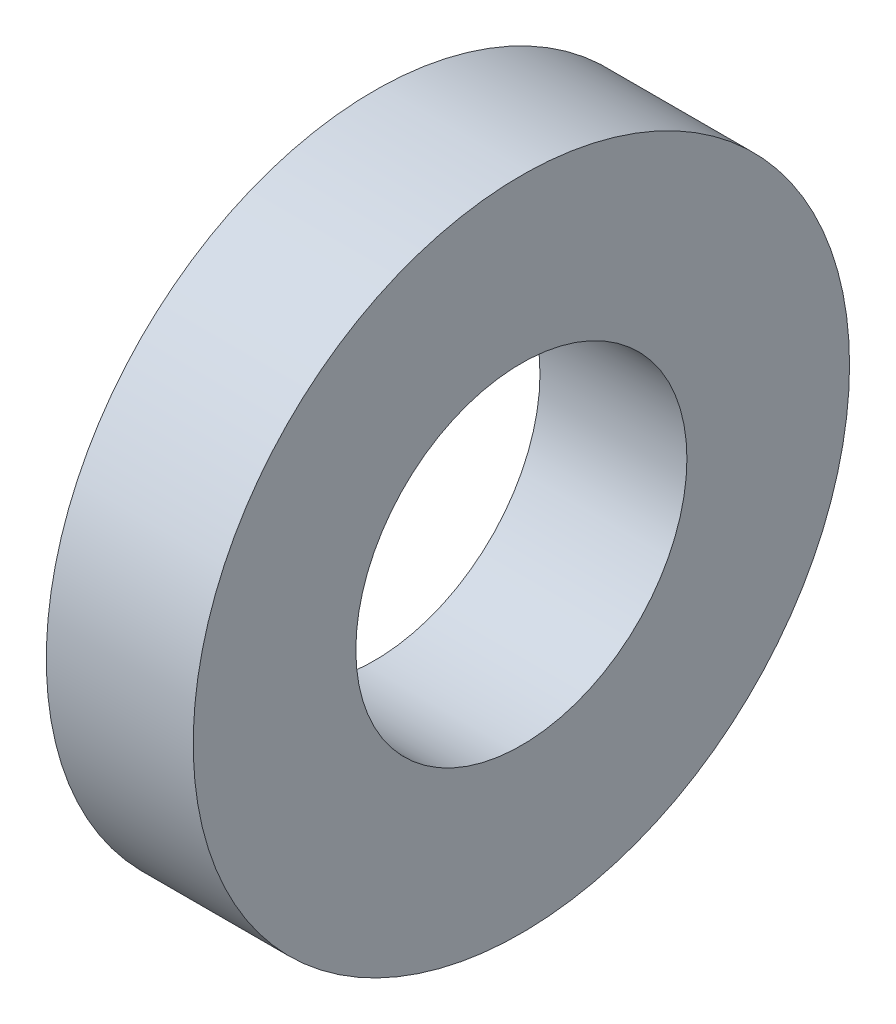
ISO-10303-21;
HEADER;
FILE_DESCRIPTION(('STEP AP214'),'2;1');
FILE_NAME('part.step','',(''),(''),'','','');
FILE_SCHEMA(('AUTOMOTIVE_DESIGN { 1 0 10303 214 1 1 1 1 }'));
ENDSEC;
DATA;
#1=APPLICATION_CONTEXT('core data for automotive mechanical design processes');
#2=APPLICATION_PROTOCOL_DEFINITION('international standard','automotive_design',2000,#1);
#3=PRODUCT_CONTEXT('',#1,'mechanical');
#4=PRODUCT('Part','Part','',(#3));
#5=PRODUCT_RELATED_PRODUCT_CATEGORY('part','',(#4));
#6=PRODUCT_DEFINITION_FORMATION('','',#4);
#7=PRODUCT_DEFINITION_CONTEXT('part definition',#1,'design');
#8=PRODUCT_DEFINITION('design','',#6,#7);
#9=PRODUCT_DEFINITION_SHAPE('','',#8);
#10=(LENGTH_UNIT() NAMED_UNIT(*) SI_UNIT(.MILLI.,.METRE.));
#11=(NAMED_UNIT(*) PLANE_ANGLE_UNIT() SI_UNIT($,.RADIAN.));
#12=(NAMED_UNIT(*) SI_UNIT($,.STERADIAN.) SOLID_ANGLE_UNIT());
#13=UNCERTAINTY_MEASURE_WITH_UNIT(LENGTH_MEASURE(1.E-05),#10,'distance_accuracy_value','');
#14=(GEOMETRIC_REPRESENTATION_CONTEXT(3) GLOBAL_UNCERTAINTY_ASSIGNED_CONTEXT((#13)) GLOBAL_UNIT_ASSIGNED_CONTEXT((#10,
#11,#12)) REPRESENTATION_CONTEXT('',''));
#15=CARTESIAN_POINT('',(0.,0.,0.));
#16=DIRECTION('',(0.,0.,1.));
#17=DIRECTION('',(1.,0.,0.));
#18=AXIS2_PLACEMENT_3D('',#15,#16,#17);
#19=CARTESIAN_POINT('',(15.,0.,0.));
#20=DIRECTION('',(1.,0.,0.));
#21=DIRECTION('',(0.,0.,-1.));
#22=AXIS2_PLACEMENT_3D('',#19,#20,#21);
#23=PLANE('',#22);
#24=CARTESIAN_POINT('',(15.,0.,0.));
#25=DIRECTION('',(1.,0.,0.));
#26=DIRECTION('',(0.,0.,-1.));
#27=AXIS2_PLACEMENT_3D('',#24,#25,#26);
#28=CIRCLE('',#27,33.5);
#29=CARTESIAN_POINT('',(15.,0.,-33.5));
#30=VERTEX_POINT('',#29);
#31=EDGE_CURVE('E10',#30,#30,#28,.T.);
#32=ORIENTED_EDGE('',*,*,#31,.T.);
#33=EDGE_LOOP('',(#32));
#34=FACE_BOUND('',#33,.T.);
#35=CARTESIAN_POINT('',(15.,0.,0.));
#36=DIRECTION('',(1.,0.,0.));
#37=DIRECTION('',(0.,0.,-1.));
#38=AXIS2_PLACEMENT_3D('',#35,#36,#37);
#39=CIRCLE('',#38,16.9);
#40=CARTESIAN_POINT('',(15.,0.,-16.9));
#41=VERTEX_POINT('',#40);
#42=EDGE_CURVE('E44',#41,#41,#39,.T.);
#43=ORIENTED_EDGE('',*,*,#42,.F.);
#44=EDGE_LOOP('',(#43));
#45=FACE_BOUND('',#44,.T.);
#46=ADVANCED_FACE('F33',(#34,#45),#23,.T.);
#47=CARTESIAN_POINT('',(0.,0.,0.));
#48=DIRECTION('',(1.,0.,0.));
#49=DIRECTION('',(0.,0.,-1.));
#50=AXIS2_PLACEMENT_3D('',#47,#48,#49);
#51=PLANE('',#50);
#52=CARTESIAN_POINT('',(0.,0.,0.));
#53=DIRECTION('',(1.,0.,0.));
#54=DIRECTION('',(0.,0.,-1.));
#55=AXIS2_PLACEMENT_3D('',#52,#53,#54);
#56=CIRCLE('',#55,33.5);
#57=CARTESIAN_POINT('',(0.,0.,-33.5));
#58=VERTEX_POINT('',#57);
#59=EDGE_CURVE('E37',#58,#58,#56,.T.);
#60=ORIENTED_EDGE('',*,*,#59,.F.);
#61=EDGE_LOOP('',(#60));
#62=FACE_BOUND('',#61,.T.);
#63=CARTESIAN_POINT('',(0.,0.,0.));
#64=DIRECTION('',(1.,0.,0.));
#65=DIRECTION('',(0.,0.,-1.));
#66=AXIS2_PLACEMENT_3D('',#63,#64,#65);
#67=CIRCLE('',#66,16.9);
#68=CARTESIAN_POINT('',(0.,0.,-16.9));
#69=VERTEX_POINT('',#68);
#70=EDGE_CURVE('E46',#69,#69,#67,.T.);
#71=ORIENTED_EDGE('',*,*,#70,.T.);
#72=EDGE_LOOP('',(#71));
#73=FACE_BOUND('',#72,.T.);
#74=ADVANCED_FACE('F56',(#62,#73),#51,.F.);
#75=CARTESIAN_POINT('',(15.,0.,0.));
#76=DIRECTION('',(-1.,0.,0.));
#77=DIRECTION('',(0.,0.,1.));
#78=AXIS2_PLACEMENT_3D('',#75,#76,#77);
#79=CYLINDRICAL_SURFACE('',#78,33.5);
#80=ORIENTED_EDGE('',*,*,#31,.F.);
#81=EDGE_LOOP('',(#80));
#82=FACE_BOUND('',#81,.T.);
#83=ORIENTED_EDGE('',*,*,#59,.T.);
#84=EDGE_LOOP('',(#83));
#85=FACE_BOUND('',#84,.T.);
#86=ADVANCED_FACE('F35',(#82,#85),#79,.T.);
#87=CARTESIAN_POINT('',(15.,0.,0.));
#88=DIRECTION('',(-1.,0.,0.));
#89=DIRECTION('',(0.,0.,1.));
#90=AXIS2_PLACEMENT_3D('',#87,#88,#89);
#91=CYLINDRICAL_SURFACE('',#90,16.9);
#92=ORIENTED_EDGE('',*,*,#42,.T.);
#93=EDGE_LOOP('',(#92));
#94=FACE_BOUND('',#93,.T.);
#95=ORIENTED_EDGE('',*,*,#70,.F.);
#96=EDGE_LOOP('',(#95));
#97=FACE_BOUND('',#96,.T.);
#98=ADVANCED_FACE('F52',(#94,#97),#91,.F.);
#99=CLOSED_SHELL('',(#46,#74,#86,#98));
#100=MANIFOLD_SOLID_BREP('B2',#99);
#101=ADVANCED_BREP_SHAPE_REPRESENTATION('',(#18,#100),#14);
#102=SHAPE_DEFINITION_REPRESENTATION(#9,#101);
ENDSEC;
END-ISO-10303-21;
